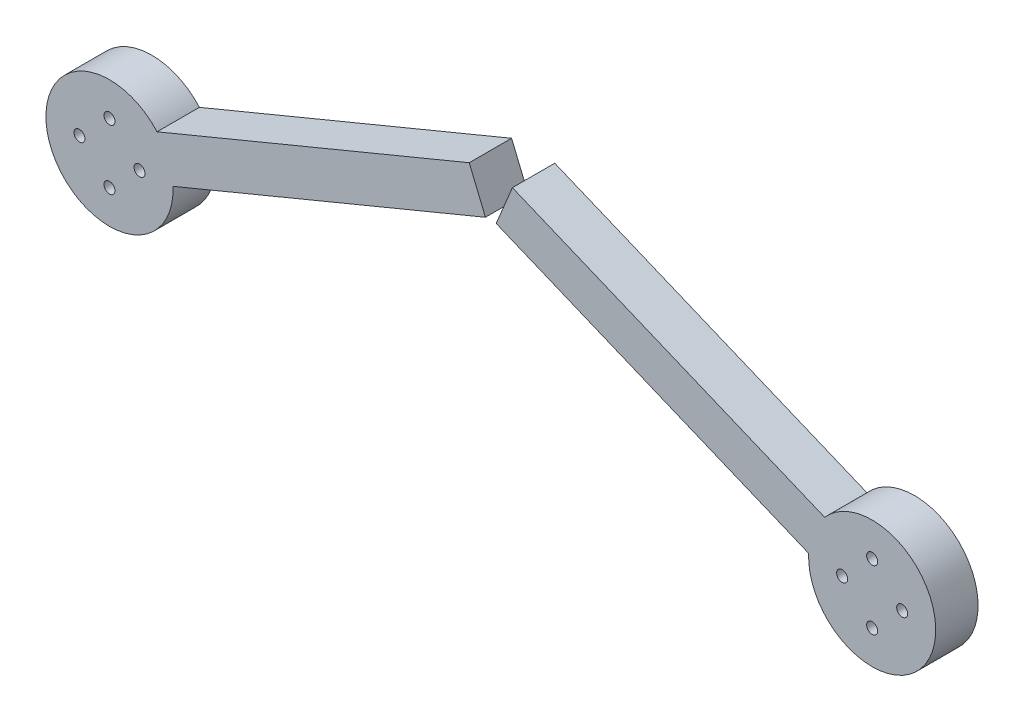
ISO-10303-21;
HEADER;
FILE_DESCRIPTION(('STEP AP214'),'2;1');
FILE_NAME('part.step','',(''),(''),'','','');
FILE_SCHEMA(('AUTOMOTIVE_DESIGN { 1 0 10303 214 1 1 1 1 }'));
ENDSEC;
DATA;
#1=APPLICATION_CONTEXT('core data for automotive mechanical design processes');
#2=APPLICATION_PROTOCOL_DEFINITION('international standard','automotive_design',2000,#1);
#3=PRODUCT_CONTEXT('',#1,'mechanical');
#4=PRODUCT('Part','Part','',(#3));
#5=PRODUCT_RELATED_PRODUCT_CATEGORY('part','',(#4));
#6=PRODUCT_DEFINITION_FORMATION('','',#4);
#7=PRODUCT_DEFINITION_CONTEXT('part definition',#1,'design');
#8=PRODUCT_DEFINITION('design','',#6,#7);
#9=PRODUCT_DEFINITION_SHAPE('','',#8);
#10=(LENGTH_UNIT() NAMED_UNIT(*) SI_UNIT(.MILLI.,.METRE.));
#11=(NAMED_UNIT(*) PLANE_ANGLE_UNIT() SI_UNIT($,.RADIAN.));
#12=(NAMED_UNIT(*) SI_UNIT($,.STERADIAN.) SOLID_ANGLE_UNIT());
#13=UNCERTAINTY_MEASURE_WITH_UNIT(LENGTH_MEASURE(1.E-05),#10,'distance_accuracy_value','');
#14=(GEOMETRIC_REPRESENTATION_CONTEXT(3) GLOBAL_UNCERTAINTY_ASSIGNED_CONTEXT((#13)) GLOBAL_UNIT_ASSIGNED_CONTEXT((#10,
#11,#12)) REPRESENTATION_CONTEXT('',''));
#15=CARTESIAN_POINT('',(0.,0.,0.));
#16=DIRECTION('',(0.,0.,1.));
#17=DIRECTION('',(1.,0.,0.));
#18=AXIS2_PLACEMENT_3D('',#15,#16,#17);
#19=CARTESIAN_POINT('',(-12.3515637431712,-29.8193127052797,25.4));
#20=DIRECTION('',(0.382683432365091,0.923879532511286,0.));
#21=DIRECTION('',(-0.923879532511286,0.382683432365091,0.));
#22=AXIS2_PLACEMENT_3D('',#19,#20,#21);
#23=PLANE('',#22);
#24=DIRECTION('',(0.923879532511287,-0.382683432365091,0.));
#25=VECTOR('',#24,1.);
#26=CARTESIAN_POINT('',(-12.3515637431712,-29.8193127052797,0.));
#27=LINE('',#26,#25);
#28=CARTESIAN_POINT('',(3.2217554709008,-36.2699927349138,0.));
#29=VERTEX_POINT('',#28);
#30=CARTESIAN_POINT('',(190.539683929956,-113.859619178288,0.));
#31=VERTEX_POINT('',#30);
#32=EDGE_CURVE('E111',#29,#31,#27,.T.);
#33=ORIENTED_EDGE('',*,*,#32,.T.);
#34=DIRECTION('',(0.,0.,-1.));
#35=VECTOR('',#34,1.);
#36=CARTESIAN_POINT('',(190.539683929956,-113.859619178288,25.4));
#37=LINE('',#36,#35);
#38=CARTESIAN_POINT('',(190.539683929956,-113.859619178288,25.4));
#39=VERTEX_POINT('',#38);
#40=EDGE_CURVE('E12',#39,#31,#37,.T.);
#41=ORIENTED_EDGE('',*,*,#40,.F.);
#42=DIRECTION('',(0.923879532511287,-0.382683432365091,0.));
#43=VECTOR('',#42,1.);
#44=CARTESIAN_POINT('',(-12.3515637431712,-29.8193127052797,25.4));
#45=LINE('',#44,#43);
#46=CARTESIAN_POINT('',(3.2217554709008,-36.2699927349138,25.4));
#47=VERTEX_POINT('',#46);
#48=EDGE_CURVE('E96',#47,#39,#45,.T.);
#49=ORIENTED_EDGE('',*,*,#48,.F.);
#50=DIRECTION('',(0.,0.,-1.));
#51=VECTOR('',#50,1.);
#52=CARTESIAN_POINT('',(3.2217554709008,-36.2699927349138,25.4));
#53=LINE('',#52,#51);
#54=EDGE_CURVE('E107',#47,#29,#53,.T.);
#55=ORIENTED_EDGE('',*,*,#54,.T.);
#56=EDGE_LOOP('',(#33,#41,#49,#55));
#57=FACE_BOUND('',#56,.T.);
#58=ADVANCED_FACE('F49',(#57),#23,.F.);
#59=CARTESIAN_POINT('',(228.6,-115.598107213448,25.4));
#60=DIRECTION('',(0.,0.,-1.));
#61=DIRECTION('',(-1.,0.,0.));
#62=AXIS2_PLACEMENT_3D('',#59,#60,#61);
#63=CYLINDRICAL_SURFACE('',#62,38.1);
#64=CARTESIAN_POINT('',(228.6,-115.598107213448,0.));
#65=DIRECTION('',(0.,0.,1.));
#66=DIRECTION('',(1.,0.,0.));
#67=AXIS2_PLACEMENT_3D('',#64,#65,#66);
#68=CIRCLE('',#67,38.1);
#69=CARTESIAN_POINT('',(200.090704327211,-90.3230194739062,0.));
#70=VERTEX_POINT('',#69);
#71=EDGE_CURVE('E101',#31,#70,#68,.T.);
#72=ORIENTED_EDGE('',*,*,#71,.T.);
#73=DIRECTION('',(0.,0.,-1.));
#74=VECTOR('',#73,1.);
#75=CARTESIAN_POINT('',(200.090704327211,-90.3230194739062,25.4));
#76=LINE('',#75,#74);
#77=CARTESIAN_POINT('',(200.090704327211,-90.3230194739062,25.4));
#78=VERTEX_POINT('',#77);
#79=EDGE_CURVE('E57',#78,#70,#76,.T.);
#80=ORIENTED_EDGE('',*,*,#79,.F.);
#81=CARTESIAN_POINT('',(228.6,-115.598107213448,25.4));
#82=DIRECTION('',(0.,0.,1.));
#83=DIRECTION('',(1.,0.,0.));
#84=AXIS2_PLACEMENT_3D('',#81,#82,#83);
#85=CIRCLE('',#84,38.1);
#86=EDGE_CURVE('E91',#39,#78,#85,.T.);
#87=ORIENTED_EDGE('',*,*,#86,.F.);
#88=ORIENTED_EDGE('',*,*,#40,.T.);
#89=EDGE_LOOP('',(#72,#80,#87,#88));
#90=FACE_BOUND('',#89,.T.);
#91=ADVANCED_FACE('F100',(#90),#63,.T.);
#92=CARTESIAN_POINT('',(-2.63140456109792,-6.35277257949301,25.4));
#93=DIRECTION('',(0.382683432365091,0.923879532511287,0.));
#94=DIRECTION('',(-0.923879532511287,0.382683432365091,0.));
#95=AXIS2_PLACEMENT_3D('',#92,#93,#94);
#96=PLANE('',#95);
#97=DIRECTION('',(0.923879532511287,-0.382683432365091,0.));
#98=VECTOR('',#97,1.);
#99=CARTESIAN_POINT('',(-2.63140456109792,-6.35277257949301,0.));
#100=LINE('',#99,#98);
#101=CARTESIAN_POINT('',(12.941914652974,-12.8034526091271,0.));
#102=VERTEX_POINT('',#101);
#103=EDGE_CURVE('E116',#102,#70,#100,.T.);
#104=ORIENTED_EDGE('',*,*,#103,.F.);
#105=DIRECTION('',(0.,0.,-1.));
#106=VECTOR('',#105,1.);
#107=CARTESIAN_POINT('',(12.941914652974,-12.8034526091271,25.4));
#108=LINE('',#107,#106);
#109=CARTESIAN_POINT('',(12.941914652974,-12.8034526091271,25.4));
#110=VERTEX_POINT('',#109);
#111=EDGE_CURVE('E81',#110,#102,#108,.T.);
#112=ORIENTED_EDGE('',*,*,#111,.F.);
#113=DIRECTION('',(0.923879532511287,-0.382683432365091,0.));
#114=VECTOR('',#113,1.);
#115=CARTESIAN_POINT('',(-2.63140456109792,-6.35277257949301,25.4));
#116=LINE('',#115,#114);
#117=EDGE_CURVE('E94',#110,#78,#116,.T.);
#118=ORIENTED_EDGE('',*,*,#117,.T.);
#119=ORIENTED_EDGE('',*,*,#79,.T.);
#120=EDGE_LOOP('',(#104,#112,#118,#119));
#121=FACE_BOUND('',#120,.T.);
#122=ADVANCED_FACE('F105',(#121),#96,.T.);
#123=CARTESIAN_POINT('',(15.573319214072,-6.45068002963409,25.4));
#124=DIRECTION('',(0.923879532511287,-0.382683432365089,0.));
#125=DIRECTION('',(0.382683432365089,0.923879532511287,0.));
#126=AXIS2_PLACEMENT_3D('',#123,#124,#125);
#127=PLANE('',#126);
#128=DIRECTION('',(-0.382683432365089,-0.923879532511287,0.));
#129=VECTOR('',#128,1.);
#130=CARTESIAN_POINT('',(15.573319214072,-6.45068002963409,0.));
#131=LINE('',#130,#129);
#132=EDGE_CURVE('E84',#102,#29,#131,.T.);
#133=ORIENTED_EDGE('',*,*,#132,.T.);
#134=ORIENTED_EDGE('',*,*,#54,.F.);
#135=DIRECTION('',(-0.382683432365089,-0.923879532511287,0.));
#136=VECTOR('',#135,1.);
#137=CARTESIAN_POINT('',(15.573319214072,-6.45068002963409,25.4));
#138=LINE('',#137,#136);
#139=EDGE_CURVE('E65',#110,#47,#138,.T.);
#140=ORIENTED_EDGE('',*,*,#139,.F.);
#141=ORIENTED_EDGE('',*,*,#111,.T.);
#142=EDGE_LOOP('',(#133,#134,#140,#141));
#143=FACE_BOUND('',#142,.T.);
#144=ADVANCED_FACE('F135',(#143),#127,.F.);
#145=CARTESIAN_POINT('',(0.,0.,25.4));
#146=DIRECTION('',(0.,0.,1.));
#147=DIRECTION('',(1.,0.,0.));
#148=AXIS2_PLACEMENT_3D('',#145,#146,#147);
#149=PLANE('',#148);
#150=CARTESIAN_POINT('',(228.6,-133.598107154448,25.4));
#151=DIRECTION('',(0.,0.,1.));
#152=DIRECTION('',(1.,0.,0.));
#153=AXIS2_PLACEMENT_3D('',#150,#151,#152);
#154=CIRCLE('',#153,3.3);
#155=CARTESIAN_POINT('',(231.9,-133.598107154448,25.4));
#156=VERTEX_POINT('',#155);
#157=EDGE_CURVE('E210',#156,#156,#154,.T.);
#158=ORIENTED_EDGE('',*,*,#157,.F.);
#159=EDGE_LOOP('',(#158));
#160=FACE_BOUND('',#159,.T.);
#161=CARTESIAN_POINT('',(210.600000059,-115.598107213448,25.4));
#162=DIRECTION('',(0.,0.,1.));
#163=DIRECTION('',(1.,0.,0.));
#164=AXIS2_PLACEMENT_3D('',#161,#162,#163);
#165=CIRCLE('',#164,3.3);
#166=CARTESIAN_POINT('',(213.900000059,-115.598107213448,25.4));
#167=VERTEX_POINT('',#166);
#168=EDGE_CURVE('E213',#167,#167,#165,.T.);
#169=ORIENTED_EDGE('',*,*,#168,.F.);
#170=EDGE_LOOP('',(#169));
#171=FACE_BOUND('',#170,.T.);
#172=CARTESIAN_POINT('',(228.6,-97.5981072724476,25.4));
#173=DIRECTION('',(0.,0.,1.));
#174=DIRECTION('',(1.,0.,0.));
#175=AXIS2_PLACEMENT_3D('',#172,#173,#174);
#176=CIRCLE('',#175,3.3);
#177=CARTESIAN_POINT('',(231.9,-97.5981072724476,25.4));
#178=VERTEX_POINT('',#177);
#179=EDGE_CURVE('E222',#178,#178,#176,.T.);
#180=ORIENTED_EDGE('',*,*,#179,.F.);
#181=EDGE_LOOP('',(#180));
#182=FACE_BOUND('',#181,.T.);
#183=CARTESIAN_POINT('',(246.599999941,-115.598107213447,25.4));
#184=DIRECTION('',(0.,0.,1.));
#185=DIRECTION('',(1.,0.,0.));
#186=AXIS2_PLACEMENT_3D('',#183,#184,#185);
#187=CIRCLE('',#186,3.3);
#188=CARTESIAN_POINT('',(249.899999941,-115.598107213447,25.4));
#189=VERTEX_POINT('',#188);
#190=EDGE_CURVE('E228',#189,#189,#187,.T.);
#191=ORIENTED_EDGE('',*,*,#190,.F.);
#192=EDGE_LOOP('',(#191));
#193=FACE_BOUND('',#192,.T.);
#194=ORIENTED_EDGE('',*,*,#48,.T.);
#195=ORIENTED_EDGE('',*,*,#86,.T.);
#196=ORIENTED_EDGE('',*,*,#117,.F.);
#197=ORIENTED_EDGE('',*,*,#139,.T.);
#198=EDGE_LOOP('',(#194,#195,#196,#197));
#199=FACE_BOUND('',#198,.T.);
#200=ADVANCED_FACE('F92',(#160,#171,#182,#193,#199),#149,.T.);
#201=CARTESIAN_POINT('',(0.,0.,0.));
#202=DIRECTION('',(0.,0.,1.));
#203=DIRECTION('',(1.,0.,0.));
#204=AXIS2_PLACEMENT_3D('',#201,#202,#203);
#205=PLANE('',#204);
#206=CARTESIAN_POINT('',(228.6,-133.598107154448,0.));
#207=DIRECTION('',(0.,0.,1.));
#208=DIRECTION('',(1.,0.,0.));
#209=AXIS2_PLACEMENT_3D('',#206,#207,#208);
#210=CIRCLE('',#209,3.3);
#211=CARTESIAN_POINT('',(231.9,-133.598107154448,0.));
#212=VERTEX_POINT('',#211);
#213=EDGE_CURVE('E212',#212,#212,#210,.T.);
#214=ORIENTED_EDGE('',*,*,#213,.T.);
#215=EDGE_LOOP('',(#214));
#216=FACE_BOUND('',#215,.T.);
#217=CARTESIAN_POINT('',(210.600000059,-115.598107213448,0.));
#218=DIRECTION('',(0.,0.,1.));
#219=DIRECTION('',(1.,0.,0.));
#220=AXIS2_PLACEMENT_3D('',#217,#218,#219);
#221=CIRCLE('',#220,3.3);
#222=CARTESIAN_POINT('',(213.900000059,-115.598107213448,0.));
#223=VERTEX_POINT('',#222);
#224=EDGE_CURVE('E216',#223,#223,#221,.T.);
#225=ORIENTED_EDGE('',*,*,#224,.T.);
#226=EDGE_LOOP('',(#225));
#227=FACE_BOUND('',#226,.T.);
#228=CARTESIAN_POINT('',(228.6,-97.5981072724476,0.));
#229=DIRECTION('',(0.,0.,1.));
#230=DIRECTION('',(1.,0.,0.));
#231=AXIS2_PLACEMENT_3D('',#228,#229,#230);
#232=CIRCLE('',#231,3.3);
#233=CARTESIAN_POINT('',(231.9,-97.5981072724476,0.));
#234=VERTEX_POINT('',#233);
#235=EDGE_CURVE('E225',#234,#234,#232,.T.);
#236=ORIENTED_EDGE('',*,*,#235,.T.);
#237=EDGE_LOOP('',(#236));
#238=FACE_BOUND('',#237,.T.);
#239=CARTESIAN_POINT('',(246.599999941,-115.598107213447,0.));
#240=DIRECTION('',(0.,0.,1.));
#241=DIRECTION('',(1.,0.,0.));
#242=AXIS2_PLACEMENT_3D('',#239,#240,#241);
#243=CIRCLE('',#242,3.3);
#244=CARTESIAN_POINT('',(249.899999941,-115.598107213447,0.));
#245=VERTEX_POINT('',#244);
#246=EDGE_CURVE('E114',#245,#245,#243,.T.);
#247=ORIENTED_EDGE('',*,*,#246,.T.);
#248=EDGE_LOOP('',(#247));
#249=FACE_BOUND('',#248,.T.);
#250=ORIENTED_EDGE('',*,*,#32,.F.);
#251=ORIENTED_EDGE('',*,*,#132,.F.);
#252=ORIENTED_EDGE('',*,*,#103,.T.);
#253=ORIENTED_EDGE('',*,*,#71,.F.);
#254=EDGE_LOOP('',(#250,#251,#252,#253));
#255=FACE_BOUND('',#254,.T.);
#256=ADVANCED_FACE('F123',(#216,#227,#238,#249,#255),#205,.F.);
#257=CARTESIAN_POINT('',(246.599999941,-115.598107213447,0.));
#258=DIRECTION('',(0.,0.,-1.));
#259=DIRECTION('',(1.,0.,0.));
#260=AXIS2_PLACEMENT_3D('',#257,#258,#259);
#261=CYLINDRICAL_SURFACE('',#260,3.3);
#262=ORIENTED_EDGE('',*,*,#190,.T.);
#263=EDGE_LOOP('',(#262));
#264=FACE_BOUND('',#263,.T.);
#265=ORIENTED_EDGE('',*,*,#246,.F.);
#266=EDGE_LOOP('',(#265));
#267=FACE_BOUND('',#266,.T.);
#268=ADVANCED_FACE('F125',(#264,#267),#261,.F.);
#269=CARTESIAN_POINT('',(228.6,-97.5981072724476,0.));
#270=DIRECTION('',(0.,0.,-1.));
#271=DIRECTION('',(1.,0.,0.));
#272=AXIS2_PLACEMENT_3D('',#269,#270,#271);
#273=CYLINDRICAL_SURFACE('',#272,3.3);
#274=ORIENTED_EDGE('',*,*,#179,.T.);
#275=EDGE_LOOP('',(#274));
#276=FACE_BOUND('',#275,.T.);
#277=ORIENTED_EDGE('',*,*,#235,.F.);
#278=EDGE_LOOP('',(#277));
#279=FACE_BOUND('',#278,.T.);
#280=ADVANCED_FACE('F132',(#276,#279),#273,.F.);
#281=CARTESIAN_POINT('',(210.600000059,-115.598107213448,0.));
#282=DIRECTION('',(0.,0.,-1.));
#283=DIRECTION('',(1.,0.,0.));
#284=AXIS2_PLACEMENT_3D('',#281,#282,#283);
#285=CYLINDRICAL_SURFACE('',#284,3.3);
#286=ORIENTED_EDGE('',*,*,#168,.T.);
#287=EDGE_LOOP('',(#286));
#288=FACE_BOUND('',#287,.T.);
#289=ORIENTED_EDGE('',*,*,#224,.F.);
#290=EDGE_LOOP('',(#289));
#291=FACE_BOUND('',#290,.T.);
#292=ADVANCED_FACE('F184',(#288,#291),#285,.F.);
#293=CARTESIAN_POINT('',(228.6,-133.598107154448,0.));
#294=DIRECTION('',(0.,0.,-1.));
#295=DIRECTION('',(1.,0.,0.));
#296=AXIS2_PLACEMENT_3D('',#293,#294,#295);
#297=CYLINDRICAL_SURFACE('',#296,3.3);
#298=ORIENTED_EDGE('',*,*,#157,.T.);
#299=EDGE_LOOP('',(#298));
#300=FACE_BOUND('',#299,.T.);
#301=ORIENTED_EDGE('',*,*,#213,.F.);
#302=EDGE_LOOP('',(#301));
#303=FACE_BOUND('',#302,.T.);
#304=ADVANCED_FACE('F194',(#300,#303),#297,.F.);
#305=CLOSED_SHELL('',(#58,#91,#122,#144,#200,#256,#268,#280,#292,#304));
#306=MANIFOLD_SOLID_BREP('B2',#305);
#307=CARTESIAN_POINT('',(0.,0.,0.));
#308=DIRECTION('',(0.,0.,1.));
#309=DIRECTION('',(1.,0.,0.));
#310=AXIS2_PLACEMENT_3D('',#307,#308,#309);
#311=PLANE('',#310);
#312=CARTESIAN_POINT('',(-246.599999941,-115.598107213447,0.));
#313=DIRECTION('',(0.,0.,-1.));
#314=DIRECTION('',(-1.,0.,0.));
#315=AXIS2_PLACEMENT_3D('',#312,#313,#314);
#316=CIRCLE('',#315,3.3);
#317=CARTESIAN_POINT('',(-249.899999941,-115.598107213447,0.));
#318=VERTEX_POINT('',#317);
#319=EDGE_CURVE('E359',#318,#318,#316,.T.);
#320=ORIENTED_EDGE('',*,*,#319,.F.);
#321=EDGE_LOOP('',(#320));
#322=FACE_BOUND('',#321,.T.);
#323=CARTESIAN_POINT('',(-228.6,-133.598107154448,0.));
#324=DIRECTION('',(0.,0.,-1.));
#325=DIRECTION('',(-1.,0.,0.));
#326=AXIS2_PLACEMENT_3D('',#323,#324,#325);
#327=CIRCLE('',#326,3.3);
#328=CARTESIAN_POINT('',(-231.9,-133.598107154448,0.));
#329=VERTEX_POINT('',#328);
#330=EDGE_CURVE('E353',#329,#329,#327,.T.);
#331=ORIENTED_EDGE('',*,*,#330,.F.);
#332=EDGE_LOOP('',(#331));
#333=FACE_BOUND('',#332,.T.);
#334=CARTESIAN_POINT('',(-228.6,-97.5981072724476,0.));
#335=DIRECTION('',(0.,0.,-1.));
#336=DIRECTION('',(-1.,0.,0.));
#337=AXIS2_PLACEMENT_3D('',#334,#335,#336);
#338=CIRCLE('',#337,3.3);
#339=CARTESIAN_POINT('',(-231.9,-97.5981072724476,0.));
#340=VERTEX_POINT('',#339);
#341=EDGE_CURVE('E341',#340,#340,#338,.T.);
#342=ORIENTED_EDGE('',*,*,#341,.F.);
#343=EDGE_LOOP('',(#342));
#344=FACE_BOUND('',#343,.T.);
#345=CARTESIAN_POINT('',(-228.6,-115.598107213448,0.));
#346=DIRECTION('',(0.,0.,1.));
#347=DIRECTION('',(1.,0.,0.));
#348=AXIS2_PLACEMENT_3D('',#345,#346,#347);
#349=CIRCLE('',#348,38.1);
#350=CARTESIAN_POINT('',(-200.090704327211,-90.3230194739062,0.));
#351=VERTEX_POINT('',#350);
#352=CARTESIAN_POINT('',(-190.539683929957,-113.859619178288,0.));
#353=VERTEX_POINT('',#352);
#354=EDGE_CURVE('E327',#351,#353,#349,.T.);
#355=ORIENTED_EDGE('',*,*,#354,.F.);
#356=DIRECTION('',(0.923879532511287,0.382683432365091,0.));
#357=VECTOR('',#356,1.);
#358=CARTESIAN_POINT('',(2.63140456109792,-6.352772579493,0.));
#359=LINE('',#358,#357);
#360=CARTESIAN_POINT('',(-12.941914652974,-12.8034526091271,0.));
#361=VERTEX_POINT('',#360);
#362=EDGE_CURVE('E333',#351,#361,#359,.T.);
#363=ORIENTED_EDGE('',*,*,#362,.T.);
#364=DIRECTION('',(0.382683432365091,-0.923879532511286,0.));
#365=VECTOR('',#364,1.);
#366=CARTESIAN_POINT('',(-15.573319214072,-6.45068002963414,0.));
#367=LINE('',#366,#365);
#368=CARTESIAN_POINT('',(-3.22175547090073,-36.2699927349138,0.));
#369=VERTEX_POINT('',#368);
#370=EDGE_CURVE('E331',#361,#369,#367,.T.);
#371=ORIENTED_EDGE('',*,*,#370,.T.);
#372=DIRECTION('',(0.923879532511287,0.38268343236509,0.));
#373=VECTOR('',#372,1.);
#374=CARTESIAN_POINT('',(12.3515637431712,-29.8193127052797,0.));
#375=LINE('',#374,#373);
#376=EDGE_CURVE('E318',#353,#369,#375,.T.);
#377=ORIENTED_EDGE('',*,*,#376,.F.);
#378=EDGE_LOOP('',(#355,#363,#371,#377));
#379=FACE_BOUND('',#378,.T.);
#380=CARTESIAN_POINT('',(-210.600000059,-115.598107213448,0.));
#381=DIRECTION('',(0.,0.,-1.));
#382=DIRECTION('',(-1.,0.,0.));
#383=AXIS2_PLACEMENT_3D('',#380,#381,#382);
#384=CIRCLE('',#383,3.3);
#385=CARTESIAN_POINT('',(-213.900000059,-115.598107213448,0.));
#386=VERTEX_POINT('',#385);
#387=EDGE_CURVE('E347',#386,#386,#384,.T.);
#388=ORIENTED_EDGE('',*,*,#387,.F.);
#389=EDGE_LOOP('',(#388));
#390=FACE_BOUND('',#389,.T.);
#391=ADVANCED_FACE('F263',(#322,#333,#344,#379,#390),#311,.F.);
#392=CARTESIAN_POINT('',(-228.6,-115.598107213448,25.4));
#393=DIRECTION('',(0.,0.,-1.));
#394=DIRECTION('',(-1.,0.,0.));
#395=AXIS2_PLACEMENT_3D('',#392,#393,#394);
#396=CYLINDRICAL_SURFACE('',#395,38.1);
#397=ORIENTED_EDGE('',*,*,#354,.T.);
#398=DIRECTION('',(0.,0.,-1.));
#399=VECTOR('',#398,1.);
#400=CARTESIAN_POINT('',(-190.539683929957,-113.859619178288,25.4));
#401=LINE('',#400,#399);
#402=CARTESIAN_POINT('',(-190.539683929957,-113.859619178288,25.4));
#403=VERTEX_POINT('',#402);
#404=EDGE_CURVE('E47',#403,#353,#401,.T.);
#405=ORIENTED_EDGE('',*,*,#404,.F.);
#406=CARTESIAN_POINT('',(-228.6,-115.598107213448,25.4));
#407=DIRECTION('',(0.,0.,1.));
#408=DIRECTION('',(1.,0.,0.));
#409=AXIS2_PLACEMENT_3D('',#406,#407,#408);
#410=CIRCLE('',#409,38.1);
#411=CARTESIAN_POINT('',(-200.090704327211,-90.3230194739062,25.4));
#412=VERTEX_POINT('',#411);
#413=EDGE_CURVE('E313',#412,#403,#410,.T.);
#414=ORIENTED_EDGE('',*,*,#413,.F.);
#415=DIRECTION('',(0.,0.,-1.));
#416=VECTOR('',#415,1.);
#417=CARTESIAN_POINT('',(-200.090704327211,-90.3230194739062,25.4));
#418=LINE('',#417,#416);
#419=EDGE_CURVE('E280',#412,#351,#418,.T.);
#420=ORIENTED_EDGE('',*,*,#419,.T.);
#421=EDGE_LOOP('',(#397,#405,#414,#420));
#422=FACE_BOUND('',#421,.T.);
#423=ADVANCED_FACE('F265',(#422),#396,.T.);
#424=CARTESIAN_POINT('',(12.3515637431712,-29.8193127052797,25.4));
#425=DIRECTION('',(-0.38268343236509,0.923879532511287,0.));
#426=DIRECTION('',(-0.923879532511287,-0.38268343236509,0.));
#427=AXIS2_PLACEMENT_3D('',#424,#425,#426);
#428=PLANE('',#427);
#429=ORIENTED_EDGE('',*,*,#376,.T.);
#430=DIRECTION('',(0.,0.,-1.));
#431=VECTOR('',#430,1.);
#432=CARTESIAN_POINT('',(-3.22175547090073,-36.2699927349138,25.4));
#433=LINE('',#432,#431);
#434=CARTESIAN_POINT('',(-3.22175547090073,-36.2699927349138,25.4));
#435=VERTEX_POINT('',#434);
#436=EDGE_CURVE('E272',#435,#369,#433,.T.);
#437=ORIENTED_EDGE('',*,*,#436,.F.);
#438=DIRECTION('',(0.923879532511287,0.38268343236509,0.));
#439=VECTOR('',#438,1.);
#440=CARTESIAN_POINT('',(12.3515637431712,-29.8193127052797,25.4));
#441=LINE('',#440,#439);
#442=EDGE_CURVE('E305',#403,#435,#441,.T.);
#443=ORIENTED_EDGE('',*,*,#442,.F.);
#444=ORIENTED_EDGE('',*,*,#404,.T.);
#445=EDGE_LOOP('',(#429,#437,#443,#444));
#446=FACE_BOUND('',#445,.T.);
#447=ADVANCED_FACE('F317',(#446),#428,.F.);
#448=CARTESIAN_POINT('',(-15.573319214072,-6.45068002963414,25.4));
#449=DIRECTION('',(0.923879532511286,0.382683432365091,0.));
#450=DIRECTION('',(-0.382683432365091,0.923879532511286,0.));
#451=AXIS2_PLACEMENT_3D('',#448,#449,#450);
#452=PLANE('',#451);
#453=ORIENTED_EDGE('',*,*,#370,.F.);
#454=DIRECTION('',(0.,0.,-1.));
#455=VECTOR('',#454,1.);
#456=CARTESIAN_POINT('',(-12.941914652974,-12.8034526091271,25.4));
#457=LINE('',#456,#455);
#458=CARTESIAN_POINT('',(-12.941914652974,-12.8034526091271,25.4));
#459=VERTEX_POINT('',#458);
#460=EDGE_CURVE('E294',#459,#361,#457,.T.);
#461=ORIENTED_EDGE('',*,*,#460,.F.);
#462=DIRECTION('',(0.382683432365091,-0.923879532511286,0.));
#463=VECTOR('',#462,1.);
#464=CARTESIAN_POINT('',(-15.573319214072,-6.45068002963414,25.4));
#465=LINE('',#464,#463);
#466=EDGE_CURVE('E312',#459,#435,#465,.T.);
#467=ORIENTED_EDGE('',*,*,#466,.T.);
#468=ORIENTED_EDGE('',*,*,#436,.T.);
#469=EDGE_LOOP('',(#453,#461,#467,#468));
#470=FACE_BOUND('',#469,.T.);
#471=ADVANCED_FACE('F321',(#470),#452,.T.);
#472=CARTESIAN_POINT('',(2.63140456109792,-6.352772579493,25.4));
#473=DIRECTION('',(-0.382683432365091,0.923879532511287,0.));
#474=DIRECTION('',(-0.923879532511287,-0.382683432365091,0.));
#475=AXIS2_PLACEMENT_3D('',#472,#473,#474);
#476=PLANE('',#475);
#477=ORIENTED_EDGE('',*,*,#362,.F.);
#478=ORIENTED_EDGE('',*,*,#419,.F.);
#479=DIRECTION('',(0.923879532511287,0.382683432365091,0.));
#480=VECTOR('',#479,1.);
#481=CARTESIAN_POINT('',(2.63140456109792,-6.352772579493,25.4));
#482=LINE('',#481,#480);
#483=EDGE_CURVE('E322',#412,#459,#482,.T.);
#484=ORIENTED_EDGE('',*,*,#483,.T.);
#485=ORIENTED_EDGE('',*,*,#460,.T.);
#486=EDGE_LOOP('',(#477,#478,#484,#485));
#487=FACE_BOUND('',#486,.T.);
#488=ADVANCED_FACE('F392',(#487),#476,.T.);
#489=CARTESIAN_POINT('',(0.,0.,25.4));
#490=DIRECTION('',(0.,0.,1.));
#491=DIRECTION('',(1.,0.,0.));
#492=AXIS2_PLACEMENT_3D('',#489,#490,#491);
#493=PLANE('',#492);
#494=CARTESIAN_POINT('',(-246.599999941,-115.598107213447,25.4));
#495=DIRECTION('',(0.,0.,-1.));
#496=DIRECTION('',(-1.,0.,0.));
#497=AXIS2_PLACEMENT_3D('',#494,#495,#496);
#498=CIRCLE('',#497,3.3);
#499=CARTESIAN_POINT('',(-249.899999941,-115.598107213447,25.4));
#500=VERTEX_POINT('',#499);
#501=EDGE_CURVE('E356',#500,#500,#498,.T.);
#502=ORIENTED_EDGE('',*,*,#501,.T.);
#503=EDGE_LOOP('',(#502));
#504=FACE_BOUND('',#503,.T.);
#505=CARTESIAN_POINT('',(-228.6,-133.598107154448,25.4));
#506=DIRECTION('',(0.,0.,-1.));
#507=DIRECTION('',(-1.,0.,0.));
#508=AXIS2_PLACEMENT_3D('',#505,#506,#507);
#509=CIRCLE('',#508,3.3);
#510=CARTESIAN_POINT('',(-231.9,-133.598107154448,25.4));
#511=VERTEX_POINT('',#510);
#512=EDGE_CURVE('E350',#511,#511,#509,.T.);
#513=ORIENTED_EDGE('',*,*,#512,.T.);
#514=EDGE_LOOP('',(#513));
#515=FACE_BOUND('',#514,.T.);
#516=CARTESIAN_POINT('',(-210.600000059,-115.598107213448,25.4));
#517=DIRECTION('',(0.,0.,-1.));
#518=DIRECTION('',(-1.,0.,0.));
#519=AXIS2_PLACEMENT_3D('',#516,#517,#518);
#520=CIRCLE('',#519,3.3);
#521=CARTESIAN_POINT('',(-213.900000059,-115.598107213448,25.4));
#522=VERTEX_POINT('',#521);
#523=EDGE_CURVE('E344',#522,#522,#520,.T.);
#524=ORIENTED_EDGE('',*,*,#523,.T.);
#525=EDGE_LOOP('',(#524));
#526=FACE_BOUND('',#525,.T.);
#527=CARTESIAN_POINT('',(-228.6,-97.5981072724476,25.4));
#528=DIRECTION('',(0.,0.,-1.));
#529=DIRECTION('',(-1.,0.,0.));
#530=AXIS2_PLACEMENT_3D('',#527,#528,#529);
#531=CIRCLE('',#530,3.3);
#532=CARTESIAN_POINT('',(-231.9,-97.5981072724476,25.4));
#533=VERTEX_POINT('',#532);
#534=EDGE_CURVE('E329',#533,#533,#531,.T.);
#535=ORIENTED_EDGE('',*,*,#534,.T.);
#536=EDGE_LOOP('',(#535));
#537=FACE_BOUND('',#536,.T.);
#538=ORIENTED_EDGE('',*,*,#413,.T.);
#539=ORIENTED_EDGE('',*,*,#442,.T.);
#540=ORIENTED_EDGE('',*,*,#466,.F.);
#541=ORIENTED_EDGE('',*,*,#483,.F.);
#542=EDGE_LOOP('',(#538,#539,#540,#541));
#543=FACE_BOUND('',#542,.T.);
#544=ADVANCED_FACE('F309',(#504,#515,#526,#537,#543),#493,.T.);
#545=CARTESIAN_POINT('',(-228.6,-97.5981072724476,0.));
#546=DIRECTION('',(0.,0.,-1.));
#547=DIRECTION('',(-1.,0.,0.));
#548=AXIS2_PLACEMENT_3D('',#545,#546,#547);
#549=CYLINDRICAL_SURFACE('',#548,3.3);
#550=ORIENTED_EDGE('',*,*,#534,.F.);
#551=EDGE_LOOP('',(#550));
#552=FACE_BOUND('',#551,.T.);
#553=ORIENTED_EDGE('',*,*,#341,.T.);
#554=EDGE_LOOP('',(#553));
#555=FACE_BOUND('',#554,.T.);
#556=ADVANCED_FACE('F377',(#552,#555),#549,.F.);
#557=CARTESIAN_POINT('',(-210.600000059,-115.598107213448,0.));
#558=DIRECTION('',(0.,0.,-1.));
#559=DIRECTION('',(-1.,0.,0.));
#560=AXIS2_PLACEMENT_3D('',#557,#558,#559);
#561=CYLINDRICAL_SURFACE('',#560,3.3);
#562=ORIENTED_EDGE('',*,*,#523,.F.);
#563=EDGE_LOOP('',(#562));
#564=FACE_BOUND('',#563,.T.);
#565=ORIENTED_EDGE('',*,*,#387,.T.);
#566=EDGE_LOOP('',(#565));
#567=FACE_BOUND('',#566,.T.);
#568=ADVANCED_FACE('F374',(#564,#567),#561,.F.);
#569=CARTESIAN_POINT('',(-228.6,-133.598107154448,0.));
#570=DIRECTION('',(0.,0.,-1.));
#571=DIRECTION('',(-1.,0.,0.));
#572=AXIS2_PLACEMENT_3D('',#569,#570,#571);
#573=CYLINDRICAL_SURFACE('',#572,3.3);
#574=ORIENTED_EDGE('',*,*,#512,.F.);
#575=EDGE_LOOP('',(#574));
#576=FACE_BOUND('',#575,.T.);
#577=ORIENTED_EDGE('',*,*,#330,.T.);
#578=EDGE_LOOP('',(#577));
#579=FACE_BOUND('',#578,.T.);
#580=ADVANCED_FACE('F376',(#576,#579),#573,.F.);
#581=CARTESIAN_POINT('',(-246.599999941,-115.598107213447,0.));
#582=DIRECTION('',(0.,0.,-1.));
#583=DIRECTION('',(-1.,0.,0.));
#584=AXIS2_PLACEMENT_3D('',#581,#582,#583);
#585=CYLINDRICAL_SURFACE('',#584,3.3);
#586=ORIENTED_EDGE('',*,*,#501,.F.);
#587=EDGE_LOOP('',(#586));
#588=FACE_BOUND('',#587,.T.);
#589=ORIENTED_EDGE('',*,*,#319,.T.);
#590=EDGE_LOOP('',(#589));
#591=FACE_BOUND('',#590,.T.);
#592=ADVANCED_FACE('F363',(#588,#591),#585,.F.);
#593=CLOSED_SHELL('',(#391,#423,#447,#471,#488,#544,#556,#568,#580,#592));
#594=MANIFOLD_SOLID_BREP('B6',#593);
#595=ADVANCED_BREP_SHAPE_REPRESENTATION('',(#18,#306,#594),#14);
#596=SHAPE_DEFINITION_REPRESENTATION(#9,#595);
ENDSEC;
END-ISO-10303-21;
